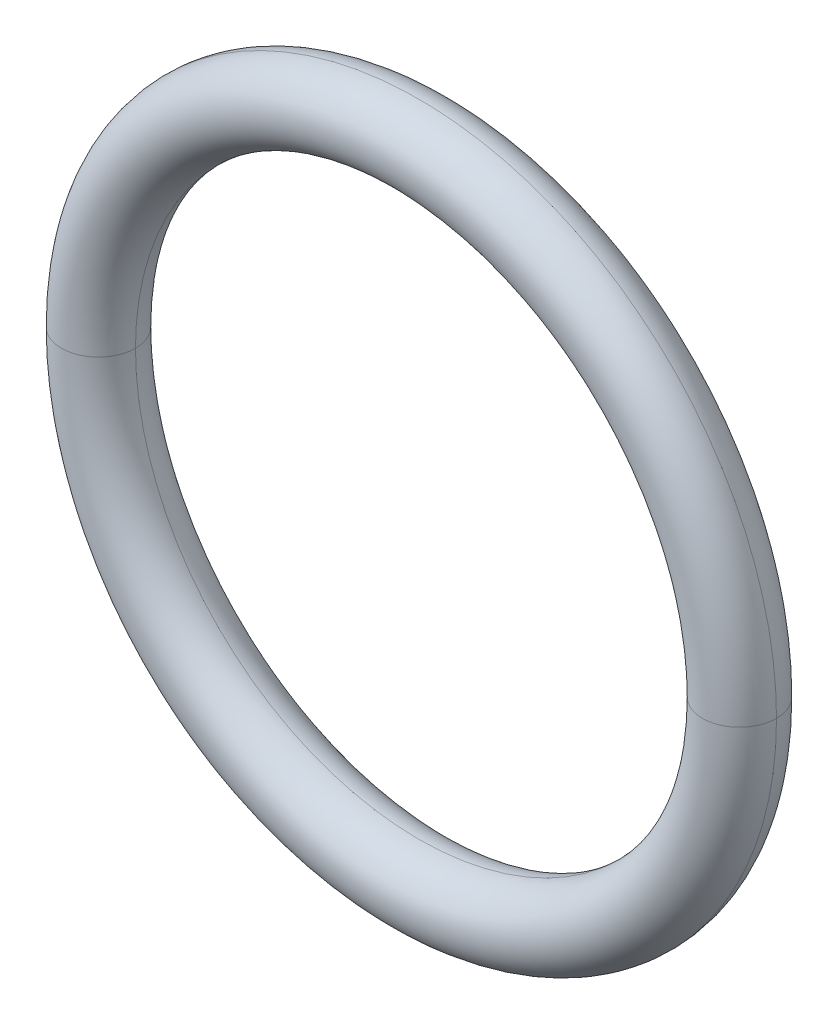
ISO-10303-21;
HEADER;
FILE_DESCRIPTION(('STEP AP214'),'2;1');
FILE_NAME('part.step','',(''),(''),'','','');
FILE_SCHEMA(('AUTOMOTIVE_DESIGN { 1 0 10303 214 1 1 1 1 }'));
ENDSEC;
DATA;
#1=APPLICATION_CONTEXT('core data for automotive mechanical design processes');
#2=APPLICATION_PROTOCOL_DEFINITION('international standard','automotive_design',2000,#1);
#3=PRODUCT_CONTEXT('',#1,'mechanical');
#4=PRODUCT('Part','Part','',(#3));
#5=PRODUCT_RELATED_PRODUCT_CATEGORY('part','',(#4));
#6=PRODUCT_DEFINITION_FORMATION('','',#4);
#7=PRODUCT_DEFINITION_CONTEXT('part definition',#1,'design');
#8=PRODUCT_DEFINITION('design','',#6,#7);
#9=PRODUCT_DEFINITION_SHAPE('','',#8);
#10=(LENGTH_UNIT() NAMED_UNIT(*) SI_UNIT(.MILLI.,.METRE.));
#11=(NAMED_UNIT(*) PLANE_ANGLE_UNIT() SI_UNIT($,.RADIAN.));
#12=(NAMED_UNIT(*) SI_UNIT($,.STERADIAN.) SOLID_ANGLE_UNIT());
#13=UNCERTAINTY_MEASURE_WITH_UNIT(LENGTH_MEASURE(1.E-05),#10,'distance_accuracy_value','');
#14=(GEOMETRIC_REPRESENTATION_CONTEXT(3) GLOBAL_UNCERTAINTY_ASSIGNED_CONTEXT((#13)) GLOBAL_UNIT_ASSIGNED_CONTEXT((#10,
#11,#12)) REPRESENTATION_CONTEXT('',''));
#15=CARTESIAN_POINT('',(0.,0.,0.));
#16=DIRECTION('',(0.,0.,1.));
#17=DIRECTION('',(1.,0.,0.));
#18=AXIS2_PLACEMENT_3D('',#15,#16,#17);
#19=CARTESIAN_POINT('',(0.,0.,0.));
#20=DIRECTION('',(0.,0.,1.));
#21=DIRECTION('',(1.,0.,0.));
#22=AXIS2_PLACEMENT_3D('',#19,#20,#21);
#23=TOROIDAL_SURFACE('',#22,6.5,0.75);
#24=CARTESIAN_POINT('',(0.,0.,0.));
#25=DIRECTION('',(0.,0.,1.));
#26=DIRECTION('',(1.,0.,0.));
#27=AXIS2_PLACEMENT_3D('',#24,#25,#26);
#28=CIRCLE('',#27,7.25);
#29=CARTESIAN_POINT('',(-7.25,0.,0.));
#30=VERTEX_POINT('',#29);
#31=CARTESIAN_POINT('',(7.25,0.,0.));
#32=VERTEX_POINT('',#31);
#33=EDGE_CURVE('E21',#30,#32,#28,.T.);
#34=ORIENTED_EDGE('',*,*,#33,.F.);
#35=CARTESIAN_POINT('',(-6.5,0.,0.));
#36=DIRECTION('',(0.,1.,0.));
#37=DIRECTION('',(-1.,0.,0.));
#38=AXIS2_PLACEMENT_3D('',#35,#36,#37);
#39=CIRCLE('',#38,0.75);
#40=CARTESIAN_POINT('',(-5.75,0.,0.));
#41=VERTEX_POINT('',#40);
#42=EDGE_CURVE('E11',#41,#30,#39,.T.);
#43=ORIENTED_EDGE('',*,*,#42,.F.);
#44=CARTESIAN_POINT('',(0.,0.,0.));
#45=DIRECTION('',(0.,0.,1.));
#46=DIRECTION('',(1.,0.,0.));
#47=AXIS2_PLACEMENT_3D('',#44,#45,#46);
#48=CIRCLE('',#47,5.75);
#49=CARTESIAN_POINT('',(5.75,0.,0.));
#50=VERTEX_POINT('',#49);
#51=EDGE_CURVE('E72',#41,#50,#48,.T.);
#52=ORIENTED_EDGE('',*,*,#51,.T.);
#53=CARTESIAN_POINT('',(6.5,0.,0.));
#54=DIRECTION('',(0.,-1.,0.));
#55=DIRECTION('',(0.,0.,-1.));
#56=AXIS2_PLACEMENT_3D('',#53,#54,#55);
#57=CIRCLE('',#56,0.75);
#58=EDGE_CURVE('E28',#50,#32,#57,.T.);
#59=ORIENTED_EDGE('',*,*,#58,.T.);
#60=EDGE_LOOP('',(#34,#43,#52,#59));
#61=FACE_BOUND('',#60,.T.);
#62=ADVANCED_FACE('F17',(#61),#23,.T.);
#63=CARTESIAN_POINT('',(0.,0.,0.));
#64=DIRECTION('',(0.,0.,1.));
#65=DIRECTION('',(1.,0.,0.));
#66=AXIS2_PLACEMENT_3D('',#63,#64,#65);
#67=TOROIDAL_SURFACE('',#66,6.5,0.75);
#68=CARTESIAN_POINT('',(0.,0.,0.));
#69=DIRECTION('',(0.,0.,1.));
#70=DIRECTION('',(1.,0.,0.));
#71=AXIS2_PLACEMENT_3D('',#68,#69,#70);
#72=CIRCLE('',#71,7.25);
#73=EDGE_CURVE('E59',#32,#30,#72,.T.);
#74=ORIENTED_EDGE('',*,*,#73,.F.);
#75=ORIENTED_EDGE('',*,*,#58,.F.);
#76=CARTESIAN_POINT('',(0.,0.,0.));
#77=DIRECTION('',(0.,0.,1.));
#78=DIRECTION('',(1.,0.,0.));
#79=AXIS2_PLACEMENT_3D('',#76,#77,#78);
#80=CIRCLE('',#79,5.75);
#81=EDGE_CURVE('E61',#50,#41,#80,.T.);
#82=ORIENTED_EDGE('',*,*,#81,.T.);
#83=ORIENTED_EDGE('',*,*,#42,.T.);
#84=EDGE_LOOP('',(#74,#75,#82,#83));
#85=FACE_BOUND('',#84,.T.);
#86=ADVANCED_FACE('F58',(#85),#67,.T.);
#87=CARTESIAN_POINT('',(0.,0.,0.));
#88=DIRECTION('',(0.,0.,1.));
#89=DIRECTION('',(1.,0.,0.));
#90=AXIS2_PLACEMENT_3D('',#87,#88,#89);
#91=TOROIDAL_SURFACE('',#90,6.5,0.75);
#92=CARTESIAN_POINT('',(6.5,0.,0.));
#93=DIRECTION('',(0.,-1.,0.));
#94=DIRECTION('',(0.,0.,-1.));
#95=AXIS2_PLACEMENT_3D('',#92,#93,#94);
#96=CIRCLE('',#95,0.75);
#97=EDGE_CURVE('E69',#32,#50,#96,.T.);
#98=ORIENTED_EDGE('',*,*,#97,.F.);
#99=ORIENTED_EDGE('',*,*,#73,.T.);
#100=CARTESIAN_POINT('',(-6.5,0.,0.));
#101=DIRECTION('',(0.,1.,0.));
#102=DIRECTION('',(-1.,0.,0.));
#103=AXIS2_PLACEMENT_3D('',#100,#101,#102);
#104=CIRCLE('',#103,0.75);
#105=EDGE_CURVE('E67',#30,#41,#104,.T.);
#106=ORIENTED_EDGE('',*,*,#105,.T.);
#107=ORIENTED_EDGE('',*,*,#81,.F.);
#108=EDGE_LOOP('',(#98,#99,#106,#107));
#109=FACE_BOUND('',#108,.T.);
#110=ADVANCED_FACE('F65',(#109),#91,.T.);
#111=CARTESIAN_POINT('',(0.,0.,0.));
#112=DIRECTION('',(0.,0.,1.));
#113=DIRECTION('',(1.,0.,0.));
#114=AXIS2_PLACEMENT_3D('',#111,#112,#113);
#115=TOROIDAL_SURFACE('',#114,6.5,0.75);
#116=ORIENTED_EDGE('',*,*,#105,.F.);
#117=ORIENTED_EDGE('',*,*,#33,.T.);
#118=ORIENTED_EDGE('',*,*,#97,.T.);
#119=ORIENTED_EDGE('',*,*,#51,.F.);
#120=EDGE_LOOP('',(#116,#117,#118,#119));
#121=FACE_BOUND('',#120,.T.);
#122=ADVANCED_FACE('F19',(#121),#115,.T.);
#123=CLOSED_SHELL('',(#62,#86,#110,#122));
#124=MANIFOLD_SOLID_BREP('B1',#123);
#125=ADVANCED_BREP_SHAPE_REPRESENTATION('',(#18,#124),#14);
#126=SHAPE_DEFINITION_REPRESENTATION(#9,#125);
ENDSEC;
END-ISO-10303-21;
